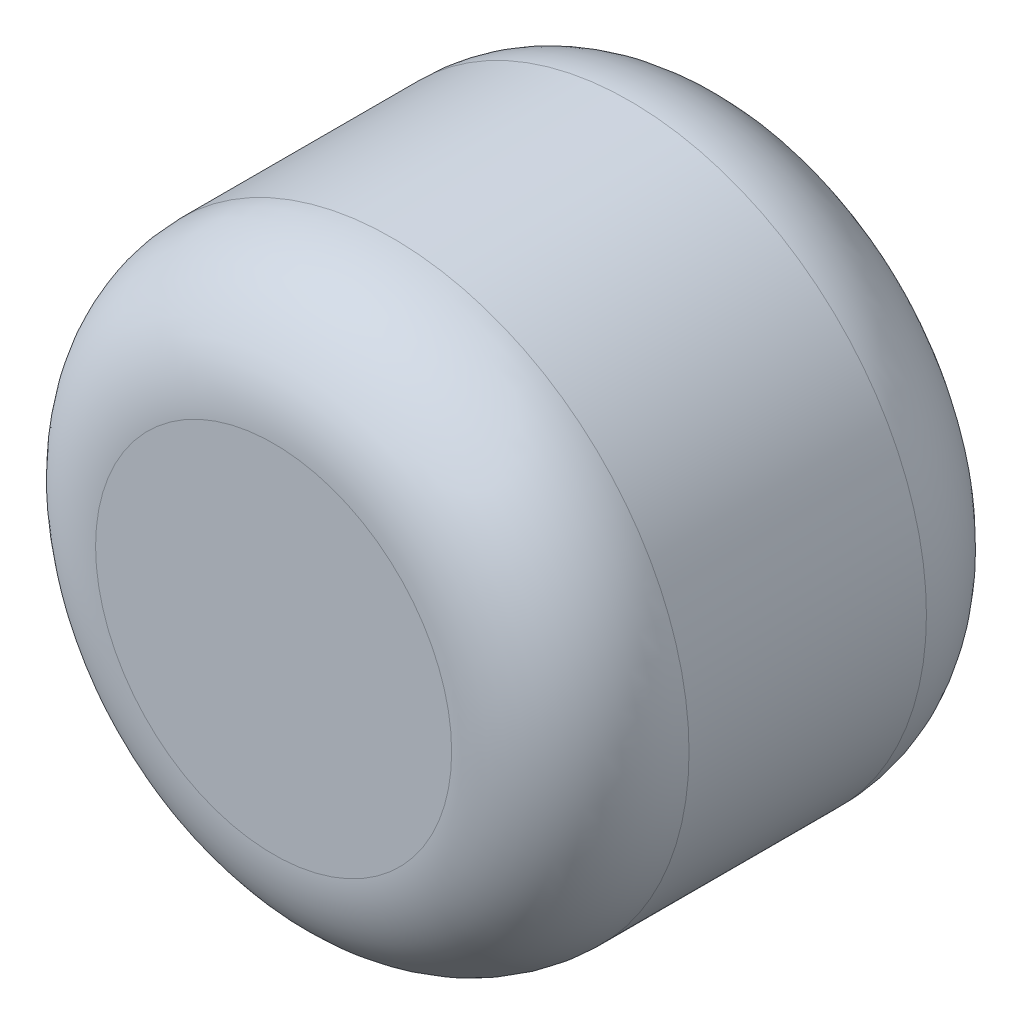
ISO-10303-21;
HEADER;
FILE_DESCRIPTION(('STEP AP214'),'2;1');
FILE_NAME('part.step','',(''),(''),'','','');
FILE_SCHEMA(('AUTOMOTIVE_DESIGN { 1 0 10303 214 1 1 1 1 }'));
ENDSEC;
DATA;
#1=APPLICATION_CONTEXT('core data for automotive mechanical design processes');
#2=APPLICATION_PROTOCOL_DEFINITION('international standard','automotive_design',2000,#1);
#3=PRODUCT_CONTEXT('',#1,'mechanical');
#4=PRODUCT('Part','Part','',(#3));
#5=PRODUCT_RELATED_PRODUCT_CATEGORY('part','',(#4));
#6=PRODUCT_DEFINITION_FORMATION('','',#4);
#7=PRODUCT_DEFINITION_CONTEXT('part definition',#1,'design');
#8=PRODUCT_DEFINITION('design','',#6,#7);
#9=PRODUCT_DEFINITION_SHAPE('','',#8);
#10=(LENGTH_UNIT() NAMED_UNIT(*) SI_UNIT(.MILLI.,.METRE.));
#11=(NAMED_UNIT(*) PLANE_ANGLE_UNIT() SI_UNIT($,.RADIAN.));
#12=(NAMED_UNIT(*) SI_UNIT($,.STERADIAN.) SOLID_ANGLE_UNIT());
#13=UNCERTAINTY_MEASURE_WITH_UNIT(LENGTH_MEASURE(1.E-05),#10,'distance_accuracy_value','');
#14=(GEOMETRIC_REPRESENTATION_CONTEXT(3) GLOBAL_UNCERTAINTY_ASSIGNED_CONTEXT((#13)) GLOBAL_UNIT_ASSIGNED_CONTEXT((#10,
#11,#12)) REPRESENTATION_CONTEXT('',''));
#15=CARTESIAN_POINT('',(0.,0.,0.));
#16=DIRECTION('',(0.,0.,1.));
#17=DIRECTION('',(1.,0.,0.));
#18=AXIS2_PLACEMENT_3D('',#15,#16,#17);
#19=CARTESIAN_POINT('',(0.,0.,101.6));
#20=DIRECTION('',(0.,0.,-1.));
#21=DIRECTION('',(-1.,0.,0.));
#22=AXIS2_PLACEMENT_3D('',#19,#20,#21);
#23=CYLINDRICAL_SURFACE('',#22,63.5);
#24=CARTESIAN_POINT('',(0.,0.,25.4));
#25=DIRECTION('',(0.,0.,1.));
#26=DIRECTION('',(1.,0.,0.));
#27=AXIS2_PLACEMENT_3D('',#24,#25,#26);
#28=CIRCLE('',#27,63.5);
#29=CARTESIAN_POINT('',(63.5,0.,25.4));
#30=VERTEX_POINT('',#29);
#31=EDGE_CURVE('E42',#30,#30,#28,.T.);
#32=ORIENTED_EDGE('',*,*,#31,.T.);
#33=EDGE_LOOP('',(#32));
#34=FACE_BOUND('',#33,.T.);
#35=CARTESIAN_POINT('',(0.,0.,76.2));
#36=DIRECTION('',(0.,0.,1.));
#37=DIRECTION('',(1.,0.,0.));
#38=AXIS2_PLACEMENT_3D('',#35,#36,#37);
#39=CIRCLE('',#38,63.5);
#40=CARTESIAN_POINT('',(63.5,0.,76.2));
#41=VERTEX_POINT('',#40);
#42=EDGE_CURVE('E46',#41,#41,#39,.F.);
#43=ORIENTED_EDGE('',*,*,#42,.T.);
#44=EDGE_LOOP('',(#43));
#45=FACE_BOUND('',#44,.T.);
#46=ADVANCED_FACE('F31',(#34,#45),#23,.T.);
#47=CARTESIAN_POINT('',(0.,0.,101.6));
#48=DIRECTION('',(0.,0.,1.));
#49=DIRECTION('',(1.,0.,0.));
#50=AXIS2_PLACEMENT_3D('',#47,#48,#49);
#51=PLANE('',#50);
#52=CARTESIAN_POINT('',(0.,0.,101.6));
#53=DIRECTION('',(0.,0.,1.));
#54=DIRECTION('',(1.,0.,0.));
#55=AXIS2_PLACEMENT_3D('',#52,#53,#54);
#56=CIRCLE('',#55,38.1);
#57=CARTESIAN_POINT('',(38.1,0.,101.6));
#58=VERTEX_POINT('',#57);
#59=EDGE_CURVE('E10',#58,#58,#56,.T.);
#60=ORIENTED_EDGE('',*,*,#59,.T.);
#61=EDGE_LOOP('',(#60));
#62=FACE_BOUND('',#61,.T.);
#63=ADVANCED_FACE('F62',(#62),#51,.T.);
#64=CARTESIAN_POINT('',(0.,0.,0.));
#65=DIRECTION('',(0.,0.,1.));
#66=DIRECTION('',(1.,0.,0.));
#67=AXIS2_PLACEMENT_3D('',#64,#65,#66);
#68=PLANE('',#67);
#69=CARTESIAN_POINT('',(0.,0.,0.));
#70=DIRECTION('',(0.,0.,1.));
#71=DIRECTION('',(1.,0.,0.));
#72=AXIS2_PLACEMENT_3D('',#69,#70,#71);
#73=CIRCLE('',#72,38.1);
#74=CARTESIAN_POINT('',(38.1,0.,0.));
#75=VERTEX_POINT('',#74);
#76=EDGE_CURVE('E38',#75,#75,#73,.F.);
#77=ORIENTED_EDGE('',*,*,#76,.T.);
#78=EDGE_LOOP('',(#77));
#79=FACE_BOUND('',#78,.T.);
#80=ADVANCED_FACE('F59',(#79),#68,.F.);
#81=CARTESIAN_POINT('',(0.,0.,25.4));
#82=DIRECTION('',(0.,0.,1.));
#83=DIRECTION('',(1.,0.,0.));
#84=AXIS2_PLACEMENT_3D('',#81,#82,#83);
#85=TOROIDAL_SURFACE('',#84,38.1,25.4);
#86=ORIENTED_EDGE('',*,*,#76,.F.);
#87=EDGE_LOOP('',(#86));
#88=FACE_BOUND('',#87,.T.);
#89=ORIENTED_EDGE('',*,*,#31,.F.);
#90=EDGE_LOOP('',(#89));
#91=FACE_BOUND('',#90,.T.);
#92=ADVANCED_FACE('F55',(#88,#91),#85,.T.);
#93=CARTESIAN_POINT('',(0.,0.,76.2));
#94=DIRECTION('',(0.,0.,1.));
#95=DIRECTION('',(1.,0.,0.));
#96=AXIS2_PLACEMENT_3D('',#93,#94,#95);
#97=TOROIDAL_SURFACE('',#96,38.1,25.4);
#98=ORIENTED_EDGE('',*,*,#42,.F.);
#99=EDGE_LOOP('',(#98));
#100=FACE_BOUND('',#99,.T.);
#101=ORIENTED_EDGE('',*,*,#59,.F.);
#102=EDGE_LOOP('',(#101));
#103=FACE_BOUND('',#102,.T.);
#104=ADVANCED_FACE('F33',(#100,#103),#97,.T.);
#105=CLOSED_SHELL('',(#46,#63,#80,#92,#104));
#106=MANIFOLD_SOLID_BREP('B2',#105);
#107=ADVANCED_BREP_SHAPE_REPRESENTATION('',(#18,#106),#14);
#108=SHAPE_DEFINITION_REPRESENTATION(#9,#107);
ENDSEC;
END-ISO-10303-21;
